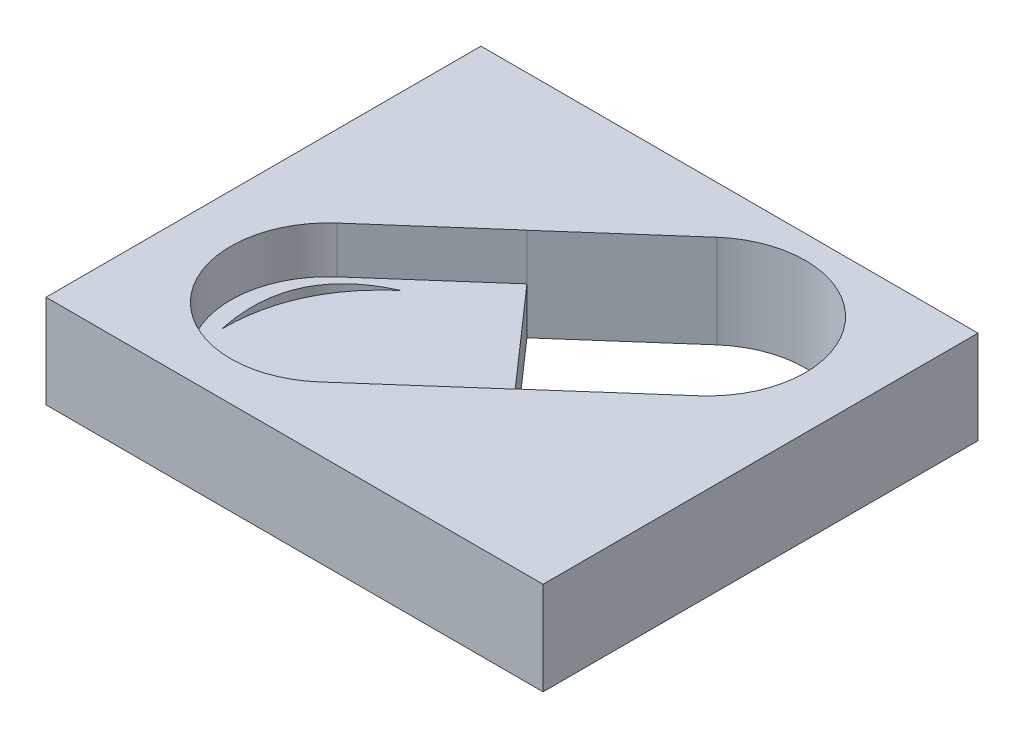
ISO-10303-21;
HEADER;
FILE_DESCRIPTION(('STEP AP214'),'2;1');
FILE_NAME('part.step','',(''),(''),'','','');
FILE_SCHEMA(('AUTOMOTIVE_DESIGN { 1 0 10303 214 1 1 1 1 }'));
ENDSEC;
DATA;
#1=APPLICATION_CONTEXT('core data for automotive mechanical design processes');
#2=APPLICATION_PROTOCOL_DEFINITION('international standard','automotive_design',2000,#1);
#3=PRODUCT_CONTEXT('',#1,'mechanical');
#4=PRODUCT('Part','Part','',(#3));
#5=PRODUCT_RELATED_PRODUCT_CATEGORY('part','',(#4));
#6=PRODUCT_DEFINITION_FORMATION('','',#4);
#7=PRODUCT_DEFINITION_CONTEXT('part definition',#1,'design');
#8=PRODUCT_DEFINITION('design','',#6,#7);
#9=PRODUCT_DEFINITION_SHAPE('','',#8);
#10=(LENGTH_UNIT() NAMED_UNIT(*) SI_UNIT(.MILLI.,.METRE.));
#11=(NAMED_UNIT(*) PLANE_ANGLE_UNIT() SI_UNIT($,.RADIAN.));
#12=(NAMED_UNIT(*) SI_UNIT($,.STERADIAN.) SOLID_ANGLE_UNIT());
#13=UNCERTAINTY_MEASURE_WITH_UNIT(LENGTH_MEASURE(1.E-05),#10,'distance_accuracy_value','');
#14=(GEOMETRIC_REPRESENTATION_CONTEXT(3) GLOBAL_UNCERTAINTY_ASSIGNED_CONTEXT((#13)) GLOBAL_UNIT_ASSIGNED_CONTEXT((#10,
#11,#12)) REPRESENTATION_CONTEXT('',''));
#15=CARTESIAN_POINT('',(0.,0.,0.));
#16=DIRECTION('',(0.,0.,1.));
#17=DIRECTION('',(1.,0.,0.));
#18=AXIS2_PLACEMENT_3D('',#15,#16,#17);
#19=CARTESIAN_POINT('',(-11.9297780426121,0.,10.4944342708712));
#20=DIRECTION('',(-0.750831192223133,0.,0.660494148940616));
#21=DIRECTION('',(0.660494148940616,0.,0.750831192223133));
#22=AXIS2_PLACEMENT_3D('',#19,#20,#21);
#23=PLANE('',#22);
#24=DIRECTION('',(-0.660494148940616,0.,-0.750831192223133));
#25=VECTOR('',#24,1.);
#26=CARTESIAN_POINT('',(-36.9354083216036,1.5,-17.9312637081039));
#27=LINE('',#26,#25);
#28=CARTESIAN_POINT('',(-32.7944322255797,1.5,-13.2239184210456));
#29=VERTEX_POINT('',#28);
#30=CARTESIAN_POINT('',(-36.9314170333111,1.5,-17.9267265237064));
#31=VERTEX_POINT('',#30);
#32=EDGE_CURVE('E50',#29,#31,#27,.T.);
#33=ORIENTED_EDGE('',*,*,#32,.F.);
#34=DIRECTION('',(0.,1.,0.));
#35=VECTOR('',#34,1.);
#36=CARTESIAN_POINT('',(-32.7944322255797,0.,-13.2239184210456));
#37=LINE('',#36,#35);
#38=CARTESIAN_POINT('',(-32.7944322255797,0.,-13.2239184210456));
#39=VERTEX_POINT('',#38);
#40=EDGE_CURVE('E201',#39,#29,#37,.T.);
#41=ORIENTED_EDGE('',*,*,#40,.F.);
#42=DIRECTION('',(0.660494148940616,0.,0.750831192223133));
#43=VECTOR('',#42,1.);
#44=CARTESIAN_POINT('',(-11.9297780426121,0.,10.4944342708712));
#45=LINE('',#44,#43);
#46=CARTESIAN_POINT('',(-36.9314170333111,0.,-17.9267265237064));
#47=VERTEX_POINT('',#46);
#48=EDGE_CURVE('E311',#47,#39,#45,.T.);
#49=ORIENTED_EDGE('',*,*,#48,.F.);
#50=DIRECTION('',(0.,1.,0.));
#51=VECTOR('',#50,1.);
#52=CARTESIAN_POINT('',(-36.9314170333111,0.,-17.9267265237064));
#53=LINE('',#52,#51);
#54=EDGE_CURVE('E323',#47,#31,#53,.T.);
#55=ORIENTED_EDGE('',*,*,#54,.T.);
#56=EDGE_LOOP('',(#33,#41,#49,#55));
#57=FACE_BOUND('',#56,.T.);
#58=ADVANCED_FACE('F33',(#57),#23,.F.);
#59=CARTESIAN_POINT('',(-38.7651295924414,0.,-15.7293127795981));
#60=CARTESIAN_POINT('',(-40.6960424517659,0.,-14.8513960927328));
#61=CARTESIAN_POINT('',(-40.92766904078,0.,-13.3429034880515));
#62=CARTESIAN_POINT('',(-40.5890811963336,0.,-11.7602870370703));
#63=B_SPLINE_CURVE_WITH_KNOTS('',3,(#59,#60,#61,#62),.UNSPECIFIED.,.F.,.F.,(4,4),(0.,1.),.UNSPECIFIED.);
#64=DIRECTION('',(0.,1.,0.));
#65=VECTOR('',#64,1.);
#66=SURFACE_OF_LINEAR_EXTRUSION('',#63,#65);
#67=CARTESIAN_POINT('',(-38.7651295924414,1.5,-15.7293127795981));
#68=CARTESIAN_POINT('',(-40.6960424517659,1.5,-14.8513960927328));
#69=CARTESIAN_POINT('',(-40.92766904078,1.5,-13.3429034880515));
#70=CARTESIAN_POINT('',(-40.5890811963336,1.5,-11.7602870370703));
#71=B_SPLINE_CURVE_WITH_KNOTS('',3,(#67,#68,#69,#70),.UNSPECIFIED.,.F.,.F.,(4,4),(0.,1.),.UNSPECIFIED.);
#72=CARTESIAN_POINT('',(-40.5890811963336,1.5,-11.7602870370703));
#73=VERTEX_POINT('',#72);
#74=CARTESIAN_POINT('',(-38.7651295924414,1.5,-15.7293127795981));
#75=VERTEX_POINT('',#74);
#76=EDGE_CURVE('E56',#73,#75,#71,.F.);
#77=ORIENTED_EDGE('',*,*,#76,.F.);
#78=DIRECTION('',(0.,1.,0.));
#79=VECTOR('',#78,1.);
#80=CARTESIAN_POINT('',(-40.5890811963336,0.,-11.7602870370703));
#81=LINE('',#80,#79);
#82=CARTESIAN_POINT('',(-40.5890811963336,0.,-11.7602870370703));
#83=VERTEX_POINT('',#82);
#84=EDGE_CURVE('E296',#83,#73,#81,.T.);
#85=ORIENTED_EDGE('',*,*,#84,.F.);
#86=CARTESIAN_POINT('',(-38.7651295924414,0.,-15.7293127795981));
#87=VERTEX_POINT('',#86);
#88=EDGE_CURVE('E194',#87,#83,#63,.T.);
#89=ORIENTED_EDGE('',*,*,#88,.F.);
#90=DIRECTION('',(0.,1.,0.));
#91=VECTOR('',#90,1.);
#92=CARTESIAN_POINT('',(-38.7651295924414,0.,-15.7293127795981));
#93=LINE('',#92,#91);
#94=EDGE_CURVE('E294',#87,#75,#93,.T.);
#95=ORIENTED_EDGE('',*,*,#94,.T.);
#96=EDGE_LOOP('',(#77,#85,#89,#95));
#97=FACE_BOUND('',#96,.T.);
#98=ADVANCED_FACE('F210',(#97),#66,.F.);
#99=CARTESIAN_POINT('',(-40.5890811963336,0.,-11.7602870370703));
#100=CARTESIAN_POINT('',(-40.6011134617255,0.,-14.1567328583167));
#101=CARTESIAN_POINT('',(-38.7651295924414,0.,-15.7293127795981));
#102=B_SPLINE_CURVE_WITH_KNOTS('',2,(#99,#100,#101),.UNSPECIFIED.,.F.,.F.,(3,3),(0.,1.),.UNSPECIFIED.);
#103=DIRECTION('',(0.,1.,0.));
#104=VECTOR('',#103,1.);
#105=SURFACE_OF_LINEAR_EXTRUSION('',#102,#104);
#106=CARTESIAN_POINT('',(-40.5890811963336,1.5,-11.7602870370703));
#107=CARTESIAN_POINT('',(-40.6011134617255,1.5,-14.1567328583167));
#108=CARTESIAN_POINT('',(-38.7651295924414,1.5,-15.7293127795981));
#109=B_SPLINE_CURVE_WITH_KNOTS('',2,(#106,#107,#108),.UNSPECIFIED.,.F.,.F.,(3,3),(0.,1.),.UNSPECIFIED.);
#110=EDGE_CURVE('E11',#75,#73,#109,.F.);
#111=ORIENTED_EDGE('',*,*,#110,.F.);
#112=ORIENTED_EDGE('',*,*,#94,.F.);
#113=EDGE_CURVE('E200',#83,#87,#102,.T.);
#114=ORIENTED_EDGE('',*,*,#113,.F.);
#115=ORIENTED_EDGE('',*,*,#84,.T.);
#116=EDGE_LOOP('',(#111,#112,#114,#115));
#117=FACE_BOUND('',#116,.T.);
#118=ADVANCED_FACE('F214',(#117),#105,.F.);
#119=CARTESIAN_POINT('',(-42.8025477707006,3.,-22.3184713375796));
#120=DIRECTION('',(1.,0.,0.));
#121=DIRECTION('',(0.,0.,-1.));
#122=AXIS2_PLACEMENT_3D('',#119,#120,#121);
#123=PLANE('',#122);
#124=DIRECTION('',(0.,0.,1.));
#125=VECTOR('',#124,1.);
#126=CARTESIAN_POINT('',(-42.8025477707006,0.,-22.3184713375796));
#127=LINE('',#126,#125);
#128=CARTESIAN_POINT('',(-42.8025477707006,0.,-22.3184713375796));
#129=VERTEX_POINT('',#128);
#130=CARTESIAN_POINT('',(-42.8025477707006,0.,-8.31847133757962));
#131=VERTEX_POINT('',#130);
#132=EDGE_CURVE('E267',#129,#131,#127,.T.);
#133=ORIENTED_EDGE('',*,*,#132,.T.);
#134=DIRECTION('',(0.,-1.,0.));
#135=VECTOR('',#134,1.);
#136=CARTESIAN_POINT('',(-42.8025477707006,3.,-8.31847133757962));
#137=LINE('',#136,#135);
#138=CARTESIAN_POINT('',(-42.8025477707006,3.,-8.31847133757962));
#139=VERTEX_POINT('',#138);
#140=EDGE_CURVE('E43',#139,#131,#137,.T.);
#141=ORIENTED_EDGE('',*,*,#140,.F.);
#142=DIRECTION('',(0.,0.,1.));
#143=VECTOR('',#142,1.);
#144=CARTESIAN_POINT('',(-42.8025477707006,3.,-22.3184713375796));
#145=LINE('',#144,#143);
#146=CARTESIAN_POINT('',(-42.8025477707006,3.,-22.3184713375796));
#147=VERTEX_POINT('',#146);
#148=EDGE_CURVE('E277',#147,#139,#145,.T.);
#149=ORIENTED_EDGE('',*,*,#148,.F.);
#150=DIRECTION('',(0.,-1.,0.));
#151=VECTOR('',#150,1.);
#152=CARTESIAN_POINT('',(-42.8025477707006,3.,-22.3184713375796));
#153=LINE('',#152,#151);
#154=EDGE_CURVE('E281',#147,#129,#153,.T.);
#155=ORIENTED_EDGE('',*,*,#154,.T.);
#156=EDGE_LOOP('',(#133,#141,#149,#155));
#157=FACE_BOUND('',#156,.T.);
#158=ADVANCED_FACE('F35',(#157),#123,.F.);
#159=CARTESIAN_POINT('',(-42.8025477707006,3.,-8.31847133757962));
#160=DIRECTION('',(0.,0.,-1.));
#161=DIRECTION('',(-1.,0.,0.));
#162=AXIS2_PLACEMENT_3D('',#159,#160,#161);
#163=PLANE('',#162);
#164=DIRECTION('',(1.,0.,0.));
#165=VECTOR('',#164,1.);
#166=CARTESIAN_POINT('',(-42.8025477707006,0.,-8.31847133757962));
#167=LINE('',#166,#165);
#168=CARTESIAN_POINT('',(-26.8025477707006,0.,-8.31847133757962));
#169=VERTEX_POINT('',#168);
#170=EDGE_CURVE('E257',#131,#169,#167,.T.);
#171=ORIENTED_EDGE('',*,*,#170,.T.);
#172=DIRECTION('',(0.,-1.,0.));
#173=VECTOR('',#172,1.);
#174=CARTESIAN_POINT('',(-26.8025477707006,3.,-8.31847133757962));
#175=LINE('',#174,#173);
#176=CARTESIAN_POINT('',(-26.8025477707006,3.,-8.31847133757962));
#177=VERTEX_POINT('',#176);
#178=EDGE_CURVE('E259',#177,#169,#175,.T.);
#179=ORIENTED_EDGE('',*,*,#178,.F.);
#180=DIRECTION('',(1.,0.,0.));
#181=VECTOR('',#180,1.);
#182=CARTESIAN_POINT('',(-42.8025477707006,3.,-8.31847133757962));
#183=LINE('',#182,#181);
#184=EDGE_CURVE('E291',#139,#177,#183,.T.);
#185=ORIENTED_EDGE('',*,*,#184,.F.);
#186=ORIENTED_EDGE('',*,*,#140,.T.);
#187=EDGE_LOOP('',(#171,#179,#185,#186));
#188=FACE_BOUND('',#187,.T.);
#189=ADVANCED_FACE('F247',(#188),#163,.F.);
#190=CARTESIAN_POINT('',(-26.8025477707006,3.,-22.3184713375796));
#191=DIRECTION('',(-1.,0.,0.));
#192=DIRECTION('',(0.,0.,1.));
#193=AXIS2_PLACEMENT_3D('',#190,#191,#192);
#194=PLANE('',#193);
#195=DIRECTION('',(0.,0.,-1.));
#196=VECTOR('',#195,1.);
#197=CARTESIAN_POINT('',(-26.8025477707006,0.,-22.3184713375796));
#198=LINE('',#197,#196);
#199=CARTESIAN_POINT('',(-26.8025477707006,0.,-22.3184713375796));
#200=VERTEX_POINT('',#199);
#201=EDGE_CURVE('E266',#169,#200,#198,.T.);
#202=ORIENTED_EDGE('',*,*,#201,.T.);
#203=DIRECTION('',(0.,-1.,0.));
#204=VECTOR('',#203,1.);
#205=CARTESIAN_POINT('',(-26.8025477707006,3.,-22.3184713375796));
#206=LINE('',#205,#204);
#207=CARTESIAN_POINT('',(-26.8025477707006,3.,-22.3184713375796));
#208=VERTEX_POINT('',#207);
#209=EDGE_CURVE('E272',#208,#200,#206,.T.);
#210=ORIENTED_EDGE('',*,*,#209,.F.);
#211=DIRECTION('',(0.,0.,-1.));
#212=VECTOR('',#211,1.);
#213=CARTESIAN_POINT('',(-26.8025477707006,3.,-22.3184713375796));
#214=LINE('',#213,#212);
#215=EDGE_CURVE('E271',#177,#208,#214,.T.);
#216=ORIENTED_EDGE('',*,*,#215,.F.);
#217=ORIENTED_EDGE('',*,*,#178,.T.);
#218=EDGE_LOOP('',(#202,#210,#216,#217));
#219=FACE_BOUND('',#218,.T.);
#220=ADVANCED_FACE('F244',(#219),#194,.F.);
#221=CARTESIAN_POINT('',(-42.8025477707006,3.,-22.3184713375796));
#222=DIRECTION('',(0.,0.,1.));
#223=DIRECTION('',(1.,0.,0.));
#224=AXIS2_PLACEMENT_3D('',#221,#222,#223);
#225=PLANE('',#224);
#226=DIRECTION('',(-1.,0.,0.));
#227=VECTOR('',#226,1.);
#228=CARTESIAN_POINT('',(-42.8025477707006,0.,-22.3184713375796));
#229=LINE('',#228,#227);
#230=EDGE_CURVE('E275',#200,#129,#229,.T.);
#231=ORIENTED_EDGE('',*,*,#230,.T.);
#232=ORIENTED_EDGE('',*,*,#154,.F.);
#233=DIRECTION('',(-1.,0.,0.));
#234=VECTOR('',#233,1.);
#235=CARTESIAN_POINT('',(-42.8025477707006,3.,-22.3184713375796));
#236=LINE('',#235,#234);
#237=EDGE_CURVE('E284',#208,#147,#236,.T.);
#238=ORIENTED_EDGE('',*,*,#237,.F.);
#239=ORIENTED_EDGE('',*,*,#209,.T.);
#240=EDGE_LOOP('',(#231,#232,#238,#239));
#241=FACE_BOUND('',#240,.T.);
#242=ADVANCED_FACE('F237',(#241),#225,.F.);
#243=CARTESIAN_POINT('',(0.,3.,0.));
#244=DIRECTION('',(0.,1.,0.));
#245=DIRECTION('',(0.,0.,1.));
#246=AXIS2_PLACEMENT_3D('',#243,#244,#245);
#247=PLANE('',#246);
#248=DIRECTION('',(-0.660494148940616,0.,-0.750831192223133));
#249=VECTOR('',#248,1.);
#250=CARTESIAN_POINT('',(-36.9354083216036,3.,-17.9312637081039));
#251=LINE('',#250,#249);
#252=CARTESIAN_POINT('',(-36.9314170333111,3.,-17.9267265237064));
#253=VERTEX_POINT('',#252);
#254=CARTESIAN_POINT('',(-36.9354083216036,3.,-17.9312637081039));
#255=VERTEX_POINT('',#254);
#256=EDGE_CURVE('E176',#253,#255,#251,.T.);
#257=ORIENTED_EDGE('',*,*,#256,.F.);
#258=DIRECTION('',(0.750831192223134,0.,-0.660494148940615));
#259=VECTOR('',#258,1.);
#260=CARTESIAN_POINT('',(-25.001638990699,3.,-28.4211607945776));
#261=LINE('',#260,#259);
#262=CARTESIAN_POINT('',(-33.6799582691615,3.,-20.7869826125402));
#263=VERTEX_POINT('',#262);
#264=EDGE_CURVE('E305',#253,#263,#261,.T.);
#265=ORIENTED_EDGE('',*,*,#264,.T.);
#266=CARTESIAN_POINT('',(-31.6114658652957,3.,-18.4355785612098));
#267=DIRECTION('',(0.,1.,0.));
#268=DIRECTION('',(0.,0.,1.));
#269=AXIS2_PLACEMENT_3D('',#266,#267,#268);
#270=CIRCLE('',#269,3.13173463714014);
#271=CARTESIAN_POINT('',(-29.54297346143,3.,-16.0841745098794));
#272=VERTEX_POINT('',#271);
#273=EDGE_CURVE('E316',#272,#263,#270,.T.);
#274=ORIENTED_EDGE('',*,*,#273,.F.);
#275=DIRECTION('',(0.750831192223133,0.,-0.660494148940616));
#276=VECTOR('',#275,1.);
#277=CARTESIAN_POINT('',(-20.8646541829676,3.,-23.7183526919168));
#278=LINE('',#277,#276);
#279=CARTESIAN_POINT('',(-32.7944322255797,3.,-13.2239184210456));
#280=VERTEX_POINT('',#279);
#281=EDGE_CURVE('E193',#280,#272,#278,.T.);
#282=ORIENTED_EDGE('',*,*,#281,.F.);
#283=CARTESIAN_POINT('',(-32.7904409372872,3.,-13.2193812366482));
#284=VERTEX_POINT('',#283);
#285=EDGE_CURVE('E167',#284,#280,#251,.T.);
#286=ORIENTED_EDGE('',*,*,#285,.F.);
#287=DIRECTION('',(0.750831192223133,0.,-0.660494148940616));
#288=VECTOR('',#287,1.);
#289=CARTESIAN_POINT('',(-32.7904409372872,3.,-13.2193812366482));
#290=LINE('',#289,#288);
#291=CARTESIAN_POINT('',(-36.0418997014368,3.,-10.3591251478144));
#292=VERTEX_POINT('',#291);
#293=EDGE_CURVE('E174',#292,#284,#290,.T.);
#294=ORIENTED_EDGE('',*,*,#293,.F.);
#295=CARTESIAN_POINT('',(-38.1143833935951,3.,-12.7150663835423));
#296=DIRECTION('',(0.,1.,0.));
#297=DIRECTION('',(0.,0.,1.));
#298=AXIS2_PLACEMENT_3D('',#295,#296,#297);
#299=CIRCLE('',#298,3.13777751927454);
#300=CARTESIAN_POINT('',(-40.1868670857533,3.,-15.0710076192701));
#301=VERTEX_POINT('',#300);
#302=EDGE_CURVE('E149',#301,#292,#299,.T.);
#303=ORIENTED_EDGE('',*,*,#302,.F.);
#304=DIRECTION('',(-0.750831192223134,0.,0.660494148940615));
#305=VECTOR('',#304,1.);
#306=CARTESIAN_POINT('',(-36.9354083216036,3.,-17.9312637081039));
#307=LINE('',#306,#305);
#308=EDGE_CURVE('E164',#255,#301,#307,.T.);
#309=ORIENTED_EDGE('',*,*,#308,.F.);
#310=EDGE_LOOP('',(#257,#265,#274,#282,#286,#294,#303,#309));
#311=FACE_BOUND('',#310,.T.);
#312=ORIENTED_EDGE('',*,*,#148,.T.);
#313=ORIENTED_EDGE('',*,*,#184,.T.);
#314=ORIENTED_EDGE('',*,*,#215,.T.);
#315=ORIENTED_EDGE('',*,*,#237,.T.);
#316=EDGE_LOOP('',(#312,#313,#314,#315));
#317=FACE_BOUND('',#316,.T.);
#318=ADVANCED_FACE('F234',(#311,#317),#247,.T.);
#319=CARTESIAN_POINT('',(0.,0.,0.));
#320=DIRECTION('',(0.,1.,0.));
#321=DIRECTION('',(0.,0.,1.));
#322=AXIS2_PLACEMENT_3D('',#319,#320,#321);
#323=PLANE('',#322);
#324=ORIENTED_EDGE('',*,*,#113,.T.);
#325=ORIENTED_EDGE('',*,*,#88,.T.);
#326=EDGE_LOOP('',(#324,#325));
#327=FACE_BOUND('',#326,.T.);
#328=ORIENTED_EDGE('',*,*,#48,.T.);
#329=DIRECTION('',(0.750831192223133,0.,-0.660494148940616));
#330=VECTOR('',#329,1.);
#331=CARTESIAN_POINT('',(-20.8646541829676,0.,-23.7183526919168));
#332=LINE('',#331,#330);
#333=CARTESIAN_POINT('',(-29.54297346143,0.,-16.0841745098794));
#334=VERTEX_POINT('',#333);
#335=EDGE_CURVE('E301',#39,#334,#332,.T.);
#336=ORIENTED_EDGE('',*,*,#335,.T.);
#337=CARTESIAN_POINT('',(-31.6114658652957,0.,-18.4355785612098));
#338=DIRECTION('',(0.,1.,0.));
#339=DIRECTION('',(0.,0.,1.));
#340=AXIS2_PLACEMENT_3D('',#337,#338,#339);
#341=CIRCLE('',#340,3.13173463714014);
#342=CARTESIAN_POINT('',(-33.6799582691615,0.,-20.7869826125402));
#343=VERTEX_POINT('',#342);
#344=EDGE_CURVE('E304',#334,#343,#341,.T.);
#345=ORIENTED_EDGE('',*,*,#344,.T.);
#346=DIRECTION('',(0.750831192223134,0.,-0.660494148940615));
#347=VECTOR('',#346,1.);
#348=CARTESIAN_POINT('',(-25.001638990699,0.,-28.4211607945776));
#349=LINE('',#348,#347);
#350=EDGE_CURVE('E308',#47,#343,#349,.T.);
#351=ORIENTED_EDGE('',*,*,#350,.F.);
#352=EDGE_LOOP('',(#328,#336,#345,#351));
#353=FACE_BOUND('',#352,.T.);
#354=ORIENTED_EDGE('',*,*,#132,.F.);
#355=ORIENTED_EDGE('',*,*,#230,.F.);
#356=ORIENTED_EDGE('',*,*,#201,.F.);
#357=ORIENTED_EDGE('',*,*,#170,.F.);
#358=EDGE_LOOP('',(#354,#355,#356,#357));
#359=FACE_BOUND('',#358,.T.);
#360=ADVANCED_FACE('F232',(#327,#353,#359),#323,.F.);
#361=CARTESIAN_POINT('',(-20.8646541829676,0.,-23.7183526919168));
#362=DIRECTION('',(0.660494148940616,0.,0.750831192223133));
#363=DIRECTION('',(0.750831192223134,0.,-0.660494148940616));
#364=AXIS2_PLACEMENT_3D('',#361,#362,#363);
#365=PLANE('',#364);
#366=ORIENTED_EDGE('',*,*,#281,.T.);
#367=DIRECTION('',(0.,1.,0.));
#368=VECTOR('',#367,1.);
#369=CARTESIAN_POINT('',(-29.54297346143,0.,-16.0841745098794));
#370=LINE('',#369,#368);
#371=EDGE_CURVE('E314',#334,#272,#370,.T.);
#372=ORIENTED_EDGE('',*,*,#371,.F.);
#373=ORIENTED_EDGE('',*,*,#335,.F.);
#374=ORIENTED_EDGE('',*,*,#40,.T.);
#375=DIRECTION('',(0.,1.,0.));
#376=VECTOR('',#375,1.);
#377=CARTESIAN_POINT('',(-32.7944322255797,0.,-13.2239184210456));
#378=LINE('',#377,#376);
#379=EDGE_CURVE('E187',#29,#280,#378,.T.);
#380=ORIENTED_EDGE('',*,*,#379,.T.);
#381=EDGE_LOOP('',(#366,#372,#373,#374,#380));
#382=FACE_BOUND('',#381,.T.);
#383=ADVANCED_FACE('F224',(#382),#365,.F.);
#384=CARTESIAN_POINT('',(-25.001638990699,0.,-28.4211607945776));
#385=DIRECTION('',(0.660494148940615,0.,0.750831192223134));
#386=DIRECTION('',(0.750831192223134,0.,-0.660494148940615));
#387=AXIS2_PLACEMENT_3D('',#384,#385,#386);
#388=PLANE('',#387);
#389=ORIENTED_EDGE('',*,*,#264,.F.);
#390=EDGE_CURVE('E326',#31,#253,#53,.T.);
#391=ORIENTED_EDGE('',*,*,#390,.F.);
#392=ORIENTED_EDGE('',*,*,#54,.F.);
#393=ORIENTED_EDGE('',*,*,#350,.T.);
#394=DIRECTION('',(0.,1.,0.));
#395=VECTOR('',#394,1.);
#396=CARTESIAN_POINT('',(-33.6799582691615,0.,-20.7869826125402));
#397=LINE('',#396,#395);
#398=EDGE_CURVE('E327',#343,#263,#397,.T.);
#399=ORIENTED_EDGE('',*,*,#398,.T.);
#400=EDGE_LOOP('',(#389,#391,#392,#393,#399));
#401=FACE_BOUND('',#400,.T.);
#402=ADVANCED_FACE('F220',(#401),#388,.T.);
#403=CARTESIAN_POINT('',(-31.6114658652957,0.,-18.4355785612098));
#404=DIRECTION('',(0.,1.,0.));
#405=DIRECTION('',(0.,0.,1.));
#406=AXIS2_PLACEMENT_3D('',#403,#404,#405);
#407=CYLINDRICAL_SURFACE('',#406,3.13173463714014);
#408=ORIENTED_EDGE('',*,*,#273,.T.);
#409=ORIENTED_EDGE('',*,*,#398,.F.);
#410=ORIENTED_EDGE('',*,*,#344,.F.);
#411=ORIENTED_EDGE('',*,*,#371,.T.);
#412=EDGE_LOOP('',(#408,#409,#410,#411));
#413=FACE_BOUND('',#412,.T.);
#414=ADVANCED_FACE('F223',(#413),#407,.F.);
#415=CARTESIAN_POINT('',(-36.9354083216036,1.5,-17.9312637081039));
#416=DIRECTION('',(0.750831192223133,0.,-0.660494148940616));
#417=DIRECTION('',(-0.660494148940616,0.,-0.750831192223133));
#418=AXIS2_PLACEMENT_3D('',#415,#416,#417);
#419=PLANE('',#418);
#420=CARTESIAN_POINT('',(-32.7904409372872,1.5,-13.2193812366482));
#421=VERTEX_POINT('',#420);
#422=EDGE_CURVE('E170',#421,#29,#27,.T.);
#423=ORIENTED_EDGE('',*,*,#422,.F.);
#424=DIRECTION('',(0.,1.,0.));
#425=VECTOR('',#424,1.);
#426=CARTESIAN_POINT('',(-32.7904409372872,1.5,-13.2193812366482));
#427=LINE('',#426,#425);
#428=EDGE_CURVE('E153',#421,#284,#427,.T.);
#429=ORIENTED_EDGE('',*,*,#428,.T.);
#430=ORIENTED_EDGE('',*,*,#285,.T.);
#431=ORIENTED_EDGE('',*,*,#379,.F.);
#432=EDGE_LOOP('',(#423,#429,#430,#431));
#433=FACE_BOUND('',#432,.T.);
#434=ADVANCED_FACE('F228',(#433),#419,.F.);
#435=CARTESIAN_POINT('',(-38.1143833935951,1.5,-12.7150663835423));
#436=DIRECTION('',(0.,1.,0.));
#437=DIRECTION('',(0.,0.,1.));
#438=AXIS2_PLACEMENT_3D('',#435,#436,#437);
#439=PLANE('',#438);
#440=CARTESIAN_POINT('',(-38.1143833935951,1.5,-12.7150663835423));
#441=DIRECTION('',(0.,1.,0.));
#442=DIRECTION('',(0.,0.,1.));
#443=AXIS2_PLACEMENT_3D('',#440,#441,#442);
#444=CIRCLE('',#443,3.13777751927454);
#445=CARTESIAN_POINT('',(-40.1868670857533,1.5,-15.0710076192701));
#446=VERTEX_POINT('',#445);
#447=CARTESIAN_POINT('',(-36.0418997014368,1.5,-10.3591251478144));
#448=VERTEX_POINT('',#447);
#449=EDGE_CURVE('E146',#446,#448,#444,.T.);
#450=ORIENTED_EDGE('',*,*,#449,.T.);
#451=DIRECTION('',(0.750831192223133,0.,-0.660494148940616));
#452=VECTOR('',#451,1.);
#453=CARTESIAN_POINT('',(-32.7904409372872,1.5,-13.2193812366482));
#454=LINE('',#453,#452);
#455=EDGE_CURVE('E157',#448,#421,#454,.T.);
#456=ORIENTED_EDGE('',*,*,#455,.T.);
#457=ORIENTED_EDGE('',*,*,#422,.T.);
#458=ORIENTED_EDGE('',*,*,#32,.T.);
#459=CARTESIAN_POINT('',(-36.9354083216036,1.5,-17.9312637081039));
#460=VERTEX_POINT('',#459);
#461=EDGE_CURVE('E160',#31,#460,#27,.T.);
#462=ORIENTED_EDGE('',*,*,#461,.T.);
#463=DIRECTION('',(-0.750831192223134,0.,0.660494148940615));
#464=VECTOR('',#463,1.);
#465=CARTESIAN_POINT('',(-36.9354083216036,1.5,-17.9312637081039));
#466=LINE('',#465,#464);
#467=EDGE_CURVE('E154',#460,#446,#466,.T.);
#468=ORIENTED_EDGE('',*,*,#467,.T.);
#469=EDGE_LOOP('',(#450,#456,#457,#458,#462,#468));
#470=FACE_BOUND('',#469,.T.);
#471=ORIENTED_EDGE('',*,*,#76,.T.);
#472=ORIENTED_EDGE('',*,*,#110,.T.);
#473=EDGE_LOOP('',(#471,#472));
#474=FACE_BOUND('',#473,.T.);
#475=ADVANCED_FACE('F162',(#470,#474),#439,.T.);
#476=CARTESIAN_POINT('',(-38.1143833935951,1.5,-12.7150663835423));
#477=DIRECTION('',(0.,1.,0.));
#478=DIRECTION('',(0.,0.,1.));
#479=AXIS2_PLACEMENT_3D('',#476,#477,#478);
#480=CYLINDRICAL_SURFACE('',#479,3.13777751927454);
#481=ORIENTED_EDGE('',*,*,#302,.T.);
#482=DIRECTION('',(0.,1.,0.));
#483=VECTOR('',#482,1.);
#484=CARTESIAN_POINT('',(-36.0418997014368,1.5,-10.3591251478144));
#485=LINE('',#484,#483);
#486=EDGE_CURVE('E142',#448,#292,#485,.T.);
#487=ORIENTED_EDGE('',*,*,#486,.F.);
#488=ORIENTED_EDGE('',*,*,#449,.F.);
#489=DIRECTION('',(0.,1.,0.));
#490=VECTOR('',#489,1.);
#491=CARTESIAN_POINT('',(-40.1868670857533,1.5,-15.0710076192701));
#492=LINE('',#491,#490);
#493=EDGE_CURVE('E178',#446,#301,#492,.T.);
#494=ORIENTED_EDGE('',*,*,#493,.T.);
#495=EDGE_LOOP('',(#481,#487,#488,#494));
#496=FACE_BOUND('',#495,.T.);
#497=ADVANCED_FACE('F144',(#496),#480,.F.);
#498=CARTESIAN_POINT('',(-36.9354083216036,1.5,-17.9312637081039));
#499=DIRECTION('',(-0.660494148940615,0.,-0.750831192223134));
#500=DIRECTION('',(-0.750831192223134,0.,0.660494148940615));
#501=AXIS2_PLACEMENT_3D('',#498,#499,#500);
#502=PLANE('',#501);
#503=ORIENTED_EDGE('',*,*,#308,.T.);
#504=ORIENTED_EDGE('',*,*,#493,.F.);
#505=ORIENTED_EDGE('',*,*,#467,.F.);
#506=DIRECTION('',(0.,1.,0.));
#507=VECTOR('',#506,1.);
#508=CARTESIAN_POINT('',(-36.9354083216036,1.5,-17.9312637081039));
#509=LINE('',#508,#507);
#510=EDGE_CURVE('E180',#460,#255,#509,.T.);
#511=ORIENTED_EDGE('',*,*,#510,.T.);
#512=EDGE_LOOP('',(#503,#504,#505,#511));
#513=FACE_BOUND('',#512,.T.);
#514=ADVANCED_FACE('F347',(#513),#502,.F.);
#515=ORIENTED_EDGE('',*,*,#390,.T.);
#516=ORIENTED_EDGE('',*,*,#256,.T.);
#517=ORIENTED_EDGE('',*,*,#510,.F.);
#518=ORIENTED_EDGE('',*,*,#461,.F.);
#519=EDGE_LOOP('',(#515,#516,#517,#518));
#520=FACE_BOUND('',#519,.T.);
#521=ADVANCED_FACE('F345',(#520),#419,.F.);
#522=CARTESIAN_POINT('',(-32.7904409372872,1.5,-13.2193812366482));
#523=DIRECTION('',(0.660494148940616,0.,0.750831192223133));
#524=DIRECTION('',(0.750831192223134,0.,-0.660494148940616));
#525=AXIS2_PLACEMENT_3D('',#522,#523,#524);
#526=PLANE('',#525);
#527=ORIENTED_EDGE('',*,*,#293,.T.);
#528=ORIENTED_EDGE('',*,*,#428,.F.);
#529=ORIENTED_EDGE('',*,*,#455,.F.);
#530=ORIENTED_EDGE('',*,*,#486,.T.);
#531=EDGE_LOOP('',(#527,#528,#529,#530));
#532=FACE_BOUND('',#531,.T.);
#533=ADVANCED_FACE('F158',(#532),#526,.F.);
#534=CLOSED_SHELL('',(#58,#98,#118,#158,#189,#220,#242,#318,#360,#383,#402,#414,#434,#475,#497,
#514,#521,#533));
#535=MANIFOLD_SOLID_BREP('B2',#534);
#536=ADVANCED_BREP_SHAPE_REPRESENTATION('',(#18,#535),#14);
#537=SHAPE_DEFINITION_REPRESENTATION(#9,#536);
ENDSEC;
END-ISO-10303-21;
